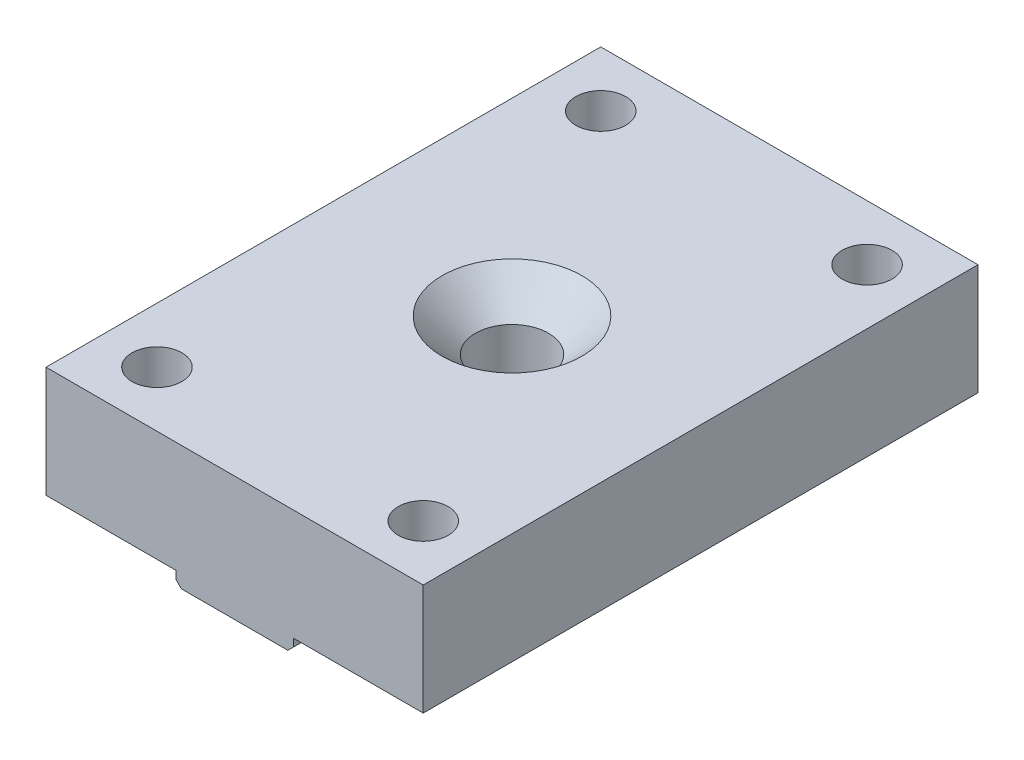
ISO-10303-21;
HEADER;
FILE_DESCRIPTION(('STEP AP214'),'2;1');
FILE_NAME('part.step','',(''),(''),'','','');
FILE_SCHEMA(('AUTOMOTIVE_DESIGN { 1 0 10303 214 1 1 1 1 }'));
ENDSEC;
DATA;
#1=APPLICATION_CONTEXT('core data for automotive mechanical design processes');
#2=APPLICATION_PROTOCOL_DEFINITION('international standard','automotive_design',2000,#1);
#3=PRODUCT_CONTEXT('',#1,'mechanical');
#4=PRODUCT('Part','Part','',(#3));
#5=PRODUCT_RELATED_PRODUCT_CATEGORY('part','',(#4));
#6=PRODUCT_DEFINITION_FORMATION('','',#4);
#7=PRODUCT_DEFINITION_CONTEXT('part definition',#1,'design');
#8=PRODUCT_DEFINITION('design','',#6,#7);
#9=PRODUCT_DEFINITION_SHAPE('','',#8);
#10=(LENGTH_UNIT() NAMED_UNIT(*) SI_UNIT(.MILLI.,.METRE.));
#11=(NAMED_UNIT(*) PLANE_ANGLE_UNIT() SI_UNIT($,.RADIAN.));
#12=(NAMED_UNIT(*) SI_UNIT($,.STERADIAN.) SOLID_ANGLE_UNIT());
#13=UNCERTAINTY_MEASURE_WITH_UNIT(LENGTH_MEASURE(1.E-05),#10,'distance_accuracy_value','');
#14=(GEOMETRIC_REPRESENTATION_CONTEXT(3) GLOBAL_UNCERTAINTY_ASSIGNED_CONTEXT((#13)) GLOBAL_UNIT_ASSIGNED_CONTEXT((#10,
#11,#12)) REPRESENTATION_CONTEXT('',''));
#15=CARTESIAN_POINT('',(0.,0.,0.));
#16=DIRECTION('',(0.,0.,1.));
#17=DIRECTION('',(1.,0.,0.));
#18=AXIS2_PLACEMENT_3D('',#15,#16,#17);
#19=CARTESIAN_POINT('',(-5.3,1.2,-50.));
#20=DIRECTION('',(-1.,0.,0.));
#21=DIRECTION('',(0.,0.,1.));
#22=AXIS2_PLACEMENT_3D('',#19,#20,#21);
#23=PLANE('',#22);
#24=DIRECTION('',(0.,-1.,0.));
#25=VECTOR('',#24,1.);
#26=CARTESIAN_POINT('',(-5.3,1.2,-50.));
#27=LINE('',#26,#25);
#28=CARTESIAN_POINT('',(-5.3,1.2,-50.));
#29=VERTEX_POINT('',#28);
#30=CARTESIAN_POINT('',(-5.3,0.499999999999994,-50.));
#31=VERTEX_POINT('',#30);
#32=EDGE_CURVE('E129',#29,#31,#27,.T.);
#33=ORIENTED_EDGE('',*,*,#32,.T.);
#34=DIRECTION('',(0.,0.,1.));
#35=VECTOR('',#34,1.);
#36=CARTESIAN_POINT('',(-5.3,0.499999999999994,-50.));
#37=LINE('',#36,#35);
#38=CARTESIAN_POINT('',(-5.3,0.499999999999994,0.));
#39=VERTEX_POINT('',#38);
#40=EDGE_CURVE('E175',#31,#39,#37,.T.);
#41=ORIENTED_EDGE('',*,*,#40,.T.);
#42=DIRECTION('',(0.,-1.,0.));
#43=VECTOR('',#42,1.);
#44=CARTESIAN_POINT('',(-5.3,1.2,0.));
#45=LINE('',#44,#43);
#46=CARTESIAN_POINT('',(-5.3,1.2,0.));
#47=VERTEX_POINT('',#46);
#48=EDGE_CURVE('E170',#47,#39,#45,.T.);
#49=ORIENTED_EDGE('',*,*,#48,.F.);
#50=DIRECTION('',(0.,0.,1.));
#51=VECTOR('',#50,1.);
#52=CARTESIAN_POINT('',(-5.3,1.2,-50.));
#53=LINE('',#52,#51);
#54=EDGE_CURVE('E173',#29,#47,#53,.T.);
#55=ORIENTED_EDGE('',*,*,#54,.F.);
#56=EDGE_LOOP('',(#33,#41,#49,#55));
#57=FACE_BOUND('',#56,.T.);
#58=ADVANCED_FACE('F39',(#57),#23,.T.);
#59=CARTESIAN_POINT('',(-17.,1.2,-50.));
#60=DIRECTION('',(0.,-1.,0.));
#61=DIRECTION('',(0.,0.,-1.));
#62=AXIS2_PLACEMENT_3D('',#59,#60,#61);
#63=PLANE('',#62);
#64=CARTESIAN_POINT('',(-12.,1.2,-5.));
#65=DIRECTION('',(0.,-1.,0.));
#66=DIRECTION('',(0.,0.,-1.));
#67=AXIS2_PLACEMENT_3D('',#64,#65,#66);
#68=CIRCLE('',#67,4.7);
#69=CARTESIAN_POINT('',(-12.,1.2,-9.7));
#70=VERTEX_POINT('',#69);
#71=EDGE_CURVE('E473',#70,#70,#68,.T.);
#72=ORIENTED_EDGE('',*,*,#71,.F.);
#73=EDGE_LOOP('',(#72));
#74=FACE_BOUND('',#73,.T.);
#75=CARTESIAN_POINT('',(-12.,1.2,-45.));
#76=DIRECTION('',(0.,-1.,0.));
#77=DIRECTION('',(0.,0.,-1.));
#78=AXIS2_PLACEMENT_3D('',#75,#76,#77);
#79=CIRCLE('',#78,4.7);
#80=CARTESIAN_POINT('',(-12.,1.2,-49.7));
#81=VERTEX_POINT('',#80);
#82=EDGE_CURVE('E455',#81,#81,#79,.T.);
#83=ORIENTED_EDGE('',*,*,#82,.F.);
#84=EDGE_LOOP('',(#83));
#85=FACE_BOUND('',#84,.T.);
#86=DIRECTION('',(1.,0.,0.));
#87=VECTOR('',#86,1.);
#88=CARTESIAN_POINT('',(-17.,1.2,0.));
#89=LINE('',#88,#87);
#90=CARTESIAN_POINT('',(-17.,1.2,0.));
#91=VERTEX_POINT('',#90);
#92=EDGE_CURVE('E167',#91,#47,#89,.T.);
#93=ORIENTED_EDGE('',*,*,#92,.F.);
#94=DIRECTION('',(0.,0.,1.));
#95=VECTOR('',#94,1.);
#96=CARTESIAN_POINT('',(-17.,1.2,-50.));
#97=LINE('',#96,#95);
#98=CARTESIAN_POINT('',(-17.,1.2,-50.));
#99=VERTEX_POINT('',#98);
#100=EDGE_CURVE('E176',#99,#91,#97,.T.);
#101=ORIENTED_EDGE('',*,*,#100,.F.);
#102=DIRECTION('',(1.,0.,0.));
#103=VECTOR('',#102,1.);
#104=CARTESIAN_POINT('',(-17.,1.2,-50.));
#105=LINE('',#104,#103);
#106=EDGE_CURVE('E146',#99,#29,#105,.T.);
#107=ORIENTED_EDGE('',*,*,#106,.T.);
#108=ORIENTED_EDGE('',*,*,#54,.T.);
#109=EDGE_LOOP('',(#93,#101,#107,#108));
#110=FACE_BOUND('',#109,.T.);
#111=ADVANCED_FACE('F222',(#74,#85,#110),#63,.T.);
#112=CARTESIAN_POINT('',(-17.,11.2,-50.));
#113=DIRECTION('',(-1.,0.,0.));
#114=DIRECTION('',(0.,0.,1.));
#115=AXIS2_PLACEMENT_3D('',#112,#113,#114);
#116=PLANE('',#115);
#117=DIRECTION('',(0.,-1.,0.));
#118=VECTOR('',#117,1.);
#119=CARTESIAN_POINT('',(-17.,11.2,0.));
#120=LINE('',#119,#118);
#121=CARTESIAN_POINT('',(-17.,11.2,0.));
#122=VERTEX_POINT('',#121);
#123=EDGE_CURVE('E164',#122,#91,#120,.T.);
#124=ORIENTED_EDGE('',*,*,#123,.F.);
#125=DIRECTION('',(0.,0.,1.));
#126=VECTOR('',#125,1.);
#127=CARTESIAN_POINT('',(-17.,11.2,-50.));
#128=LINE('',#127,#126);
#129=CARTESIAN_POINT('',(-17.,11.2,-50.));
#130=VERTEX_POINT('',#129);
#131=EDGE_CURVE('E178',#130,#122,#128,.T.);
#132=ORIENTED_EDGE('',*,*,#131,.F.);
#133=DIRECTION('',(0.,-1.,0.));
#134=VECTOR('',#133,1.);
#135=CARTESIAN_POINT('',(-17.,11.2,-50.));
#136=LINE('',#135,#134);
#137=EDGE_CURVE('E143',#130,#99,#136,.T.);
#138=ORIENTED_EDGE('',*,*,#137,.T.);
#139=ORIENTED_EDGE('',*,*,#100,.T.);
#140=EDGE_LOOP('',(#124,#132,#138,#139));
#141=FACE_BOUND('',#140,.T.);
#142=ADVANCED_FACE('F219',(#141),#116,.T.);
#143=CARTESIAN_POINT('',(17.,11.2,-50.));
#144=DIRECTION('',(0.,1.,0.));
#145=DIRECTION('',(-1.,0.,0.));
#146=AXIS2_PLACEMENT_3D('',#143,#144,#145);
#147=PLANE('',#146);
#148=CARTESIAN_POINT('',(-12.,11.2,-5.));
#149=DIRECTION('',(0.,-1.,0.));
#150=DIRECTION('',(0.,0.,-1.));
#151=AXIS2_PLACEMENT_3D('',#148,#149,#150);
#152=CIRCLE('',#151,2.25);
#153=CARTESIAN_POINT('',(-12.,11.2,-7.25));
#154=VERTEX_POINT('',#153);
#155=EDGE_CURVE('E467',#154,#154,#152,.T.);
#156=ORIENTED_EDGE('',*,*,#155,.T.);
#157=EDGE_LOOP('',(#156));
#158=FACE_BOUND('',#157,.T.);
#159=CARTESIAN_POINT('',(12.,11.2,-5.));
#160=DIRECTION('',(0.,-1.,0.));
#161=DIRECTION('',(0.,0.,-1.));
#162=AXIS2_PLACEMENT_3D('',#159,#160,#161);
#163=CIRCLE('',#162,2.25);
#164=CARTESIAN_POINT('',(12.,11.2,-7.25));
#165=VERTEX_POINT('',#164);
#166=EDGE_CURVE('E458',#165,#165,#163,.T.);
#167=ORIENTED_EDGE('',*,*,#166,.T.);
#168=EDGE_LOOP('',(#167));
#169=FACE_BOUND('',#168,.T.);
#170=CARTESIAN_POINT('',(-12.,11.2,-45.));
#171=DIRECTION('',(0.,-1.,0.));
#172=DIRECTION('',(0.,0.,-1.));
#173=AXIS2_PLACEMENT_3D('',#170,#171,#172);
#174=CIRCLE('',#173,2.25);
#175=CARTESIAN_POINT('',(-12.,11.2,-47.25));
#176=VERTEX_POINT('',#175);
#177=EDGE_CURVE('E449',#176,#176,#174,.T.);
#178=ORIENTED_EDGE('',*,*,#177,.T.);
#179=EDGE_LOOP('',(#178));
#180=FACE_BOUND('',#179,.T.);
#181=CARTESIAN_POINT('',(12.,11.2,-45.));
#182=DIRECTION('',(0.,-1.,0.));
#183=DIRECTION('',(0.,0.,-1.));
#184=AXIS2_PLACEMENT_3D('',#181,#182,#183);
#185=CIRCLE('',#184,2.25);
#186=CARTESIAN_POINT('',(12.,11.2,-47.25));
#187=VERTEX_POINT('',#186);
#188=EDGE_CURVE('E438',#187,#187,#185,.T.);
#189=ORIENTED_EDGE('',*,*,#188,.T.);
#190=EDGE_LOOP('',(#189));
#191=FACE_BOUND('',#190,.T.);
#192=CARTESIAN_POINT('',(0.,11.2,-25.));
#193=DIRECTION('',(0.,1.,0.));
#194=DIRECTION('',(0.,0.,1.));
#195=AXIS2_PLACEMENT_3D('',#192,#193,#194);
#196=CIRCLE('',#195,6.3);
#197=CARTESIAN_POINT('',(0.,11.2,-18.7));
#198=VERTEX_POINT('',#197);
#199=EDGE_CURVE('E434',#198,#198,#196,.T.);
#200=ORIENTED_EDGE('',*,*,#199,.F.);
#201=EDGE_LOOP('',(#200));
#202=FACE_BOUND('',#201,.T.);
#203=DIRECTION('',(-1.,0.,0.));
#204=VECTOR('',#203,1.);
#205=CARTESIAN_POINT('',(17.,11.2,0.));
#206=LINE('',#205,#204);
#207=CARTESIAN_POINT('',(17.,11.2,0.));
#208=VERTEX_POINT('',#207);
#209=EDGE_CURVE('E161',#208,#122,#206,.T.);
#210=ORIENTED_EDGE('',*,*,#209,.F.);
#211=DIRECTION('',(0.,0.,1.));
#212=VECTOR('',#211,1.);
#213=CARTESIAN_POINT('',(17.,11.2,-50.));
#214=LINE('',#213,#212);
#215=CARTESIAN_POINT('',(17.,11.2,-50.));
#216=VERTEX_POINT('',#215);
#217=EDGE_CURVE('E180',#216,#208,#214,.T.);
#218=ORIENTED_EDGE('',*,*,#217,.F.);
#219=DIRECTION('',(-1.,0.,0.));
#220=VECTOR('',#219,1.);
#221=CARTESIAN_POINT('',(17.,11.2,-50.));
#222=LINE('',#221,#220);
#223=EDGE_CURVE('E137',#216,#130,#222,.T.);
#224=ORIENTED_EDGE('',*,*,#223,.T.);
#225=ORIENTED_EDGE('',*,*,#131,.T.);
#226=EDGE_LOOP('',(#210,#218,#224,#225));
#227=FACE_BOUND('',#226,.T.);
#228=ADVANCED_FACE('F215',(#158,#169,#180,#191,#202,#227),#147,.T.);
#229=CARTESIAN_POINT('',(17.,1.2,-50.));
#230=DIRECTION('',(1.,0.,0.));
#231=DIRECTION('',(0.,0.,-1.));
#232=AXIS2_PLACEMENT_3D('',#229,#230,#231);
#233=PLANE('',#232);
#234=DIRECTION('',(0.,1.,0.));
#235=VECTOR('',#234,1.);
#236=CARTESIAN_POINT('',(17.,1.2,0.));
#237=LINE('',#236,#235);
#238=CARTESIAN_POINT('',(17.,1.2,0.));
#239=VERTEX_POINT('',#238);
#240=EDGE_CURVE('E158',#239,#208,#237,.T.);
#241=ORIENTED_EDGE('',*,*,#240,.F.);
#242=DIRECTION('',(0.,0.,1.));
#243=VECTOR('',#242,1.);
#244=CARTESIAN_POINT('',(17.,1.2,-50.));
#245=LINE('',#244,#243);
#246=CARTESIAN_POINT('',(17.,1.2,-50.));
#247=VERTEX_POINT('',#246);
#248=EDGE_CURVE('E128',#247,#239,#245,.T.);
#249=ORIENTED_EDGE('',*,*,#248,.F.);
#250=DIRECTION('',(0.,1.,0.));
#251=VECTOR('',#250,1.);
#252=CARTESIAN_POINT('',(17.,1.2,-50.));
#253=LINE('',#252,#251);
#254=EDGE_CURVE('E135',#247,#216,#253,.T.);
#255=ORIENTED_EDGE('',*,*,#254,.T.);
#256=ORIENTED_EDGE('',*,*,#217,.T.);
#257=EDGE_LOOP('',(#241,#249,#255,#256));
#258=FACE_BOUND('',#257,.T.);
#259=ADVANCED_FACE('F213',(#258),#233,.T.);
#260=CARTESIAN_POINT('',(5.3,1.2,-50.));
#261=DIRECTION('',(0.,-1.,0.));
#262=DIRECTION('',(0.,0.,-1.));
#263=AXIS2_PLACEMENT_3D('',#260,#261,#262);
#264=PLANE('',#263);
#265=CARTESIAN_POINT('',(12.,1.2,-5.));
#266=DIRECTION('',(0.,-1.,0.));
#267=DIRECTION('',(0.,0.,-1.));
#268=AXIS2_PLACEMENT_3D('',#265,#266,#267);
#269=CIRCLE('',#268,4.7);
#270=CARTESIAN_POINT('',(12.,1.2,-9.7));
#271=VERTEX_POINT('',#270);
#272=EDGE_CURVE('E464',#271,#271,#269,.T.);
#273=ORIENTED_EDGE('',*,*,#272,.F.);
#274=EDGE_LOOP('',(#273));
#275=FACE_BOUND('',#274,.T.);
#276=CARTESIAN_POINT('',(12.,1.2,-45.));
#277=DIRECTION('',(0.,-1.,0.));
#278=DIRECTION('',(0.,0.,-1.));
#279=AXIS2_PLACEMENT_3D('',#276,#277,#278);
#280=CIRCLE('',#279,4.7);
#281=CARTESIAN_POINT('',(12.,1.2,-49.7));
#282=VERTEX_POINT('',#281);
#283=EDGE_CURVE('E446',#282,#282,#280,.T.);
#284=ORIENTED_EDGE('',*,*,#283,.F.);
#285=EDGE_LOOP('',(#284));
#286=FACE_BOUND('',#285,.T.);
#287=DIRECTION('',(1.,0.,0.));
#288=VECTOR('',#287,1.);
#289=CARTESIAN_POINT('',(5.3,1.2,0.));
#290=LINE('',#289,#288);
#291=CARTESIAN_POINT('',(5.3,1.2,0.));
#292=VERTEX_POINT('',#291);
#293=EDGE_CURVE('E127',#292,#239,#290,.T.);
#294=ORIENTED_EDGE('',*,*,#293,.F.);
#295=DIRECTION('',(0.,0.,1.));
#296=VECTOR('',#295,1.);
#297=CARTESIAN_POINT('',(5.3,1.2,-50.));
#298=LINE('',#297,#296);
#299=CARTESIAN_POINT('',(5.3,1.2,-50.));
#300=VERTEX_POINT('',#299);
#301=EDGE_CURVE('E117',#300,#292,#298,.T.);
#302=ORIENTED_EDGE('',*,*,#301,.F.);
#303=DIRECTION('',(1.,0.,0.));
#304=VECTOR('',#303,1.);
#305=CARTESIAN_POINT('',(5.3,1.2,-50.));
#306=LINE('',#305,#304);
#307=EDGE_CURVE('E120',#300,#247,#306,.T.);
#308=ORIENTED_EDGE('',*,*,#307,.T.);
#309=ORIENTED_EDGE('',*,*,#248,.T.);
#310=EDGE_LOOP('',(#294,#302,#308,#309));
#311=FACE_BOUND('',#310,.T.);
#312=ADVANCED_FACE('F125',(#275,#286,#311),#264,.T.);
#313=CARTESIAN_POINT('',(5.3,0.,-50.));
#314=DIRECTION('',(1.,0.,0.));
#315=DIRECTION('',(0.,0.,-1.));
#316=AXIS2_PLACEMENT_3D('',#313,#314,#315);
#317=PLANE('',#316);
#318=DIRECTION('',(0.,1.,0.));
#319=VECTOR('',#318,1.);
#320=CARTESIAN_POINT('',(5.3,0.,0.));
#321=LINE('',#320,#319);
#322=CARTESIAN_POINT('',(5.3,0.5,0.));
#323=VERTEX_POINT('',#322);
#324=EDGE_CURVE('E154',#323,#292,#321,.T.);
#325=ORIENTED_EDGE('',*,*,#324,.F.);
#326=DIRECTION('',(0.,0.,-1.));
#327=VECTOR('',#326,1.);
#328=CARTESIAN_POINT('',(5.3,0.5,-50.));
#329=LINE('',#328,#327);
#330=CARTESIAN_POINT('',(5.3,0.5,-50.));
#331=VERTEX_POINT('',#330);
#332=EDGE_CURVE('E11',#323,#331,#329,.T.);
#333=ORIENTED_EDGE('',*,*,#332,.T.);
#334=DIRECTION('',(0.,1.,0.));
#335=VECTOR('',#334,1.);
#336=CARTESIAN_POINT('',(5.3,0.,-50.));
#337=LINE('',#336,#335);
#338=EDGE_CURVE('E114',#331,#300,#337,.T.);
#339=ORIENTED_EDGE('',*,*,#338,.T.);
#340=ORIENTED_EDGE('',*,*,#301,.T.);
#341=EDGE_LOOP('',(#325,#333,#339,#340));
#342=FACE_BOUND('',#341,.T.);
#343=ADVANCED_FACE('F116',(#342),#317,.T.);
#344=CARTESIAN_POINT('',(0.,0.,-50.));
#345=DIRECTION('',(0.,-1.,0.));
#346=DIRECTION('',(0.,0.,-1.));
#347=AXIS2_PLACEMENT_3D('',#344,#345,#346);
#348=PLANE('',#347);
#349=CARTESIAN_POINT('',(0.,0.,-25.));
#350=DIRECTION('',(0.,1.,0.));
#351=DIRECTION('',(0.,0.,1.));
#352=AXIS2_PLACEMENT_3D('',#349,#350,#351);
#353=CIRCLE('',#352,3.3);
#354=CARTESIAN_POINT('',(0.,0.,-21.7));
#355=VERTEX_POINT('',#354);
#356=EDGE_CURVE('E155',#355,#355,#353,.T.);
#357=ORIENTED_EDGE('',*,*,#356,.T.);
#358=EDGE_LOOP('',(#357));
#359=FACE_BOUND('',#358,.T.);
#360=DIRECTION('',(1.,0.,0.));
#361=VECTOR('',#360,1.);
#362=CARTESIAN_POINT('',(0.,0.,0.));
#363=LINE('',#362,#361);
#364=CARTESIAN_POINT('',(-4.8,0.,0.));
#365=VERTEX_POINT('',#364);
#366=CARTESIAN_POINT('',(4.80000000000001,0.,0.));
#367=VERTEX_POINT('',#366);
#368=EDGE_CURVE('E151',#365,#367,#363,.T.);
#369=ORIENTED_EDGE('',*,*,#368,.F.);
#370=DIRECTION('',(0.,0.,-1.));
#371=VECTOR('',#370,1.);
#372=CARTESIAN_POINT('',(-4.8,0.,-50.));
#373=LINE('',#372,#371);
#374=CARTESIAN_POINT('',(-4.8,0.,-50.));
#375=VERTEX_POINT('',#374);
#376=EDGE_CURVE('E192',#365,#375,#373,.T.);
#377=ORIENTED_EDGE('',*,*,#376,.T.);
#378=DIRECTION('',(1.,0.,0.));
#379=VECTOR('',#378,1.);
#380=CARTESIAN_POINT('',(-5.3,0.,-50.));
#381=LINE('',#380,#379);
#382=CARTESIAN_POINT('',(4.80000000000001,0.,-50.));
#383=VERTEX_POINT('',#382);
#384=EDGE_CURVE('E121',#375,#383,#381,.T.);
#385=ORIENTED_EDGE('',*,*,#384,.T.);
#386=DIRECTION('',(0.,0.,1.));
#387=VECTOR('',#386,1.);
#388=CARTESIAN_POINT('',(4.80000000000001,0.,-50.));
#389=LINE('',#388,#387);
#390=EDGE_CURVE('E189',#383,#367,#389,.T.);
#391=ORIENTED_EDGE('',*,*,#390,.T.);
#392=EDGE_LOOP('',(#369,#377,#385,#391));
#393=FACE_BOUND('',#392,.T.);
#394=ADVANCED_FACE('F207',(#359,#393),#348,.T.);
#395=CARTESIAN_POINT('',(0.,0.,-50.));
#396=DIRECTION('',(0.,0.,1.));
#397=DIRECTION('',(1.,0.,0.));
#398=AXIS2_PLACEMENT_3D('',#395,#396,#397);
#399=PLANE('',#398);
#400=ORIENTED_EDGE('',*,*,#384,.F.);
#401=DIRECTION('',(0.707106781186552,-0.707106781186543,0.));
#402=VECTOR('',#401,1.);
#403=CARTESIAN_POINT('',(-5.3,0.499999999999994,-50.));
#404=LINE('',#403,#402);
#405=EDGE_CURVE('E47',#375,#31,#404,.F.);
#406=ORIENTED_EDGE('',*,*,#405,.T.);
#407=ORIENTED_EDGE('',*,*,#32,.F.);
#408=ORIENTED_EDGE('',*,*,#106,.F.);
#409=ORIENTED_EDGE('',*,*,#137,.F.);
#410=ORIENTED_EDGE('',*,*,#223,.F.);
#411=ORIENTED_EDGE('',*,*,#254,.F.);
#412=ORIENTED_EDGE('',*,*,#307,.F.);
#413=ORIENTED_EDGE('',*,*,#338,.F.);
#414=DIRECTION('',(0.707106781186543,0.707106781186552,0.));
#415=VECTOR('',#414,1.);
#416=CARTESIAN_POINT('',(4.80000000000001,0.,-50.));
#417=LINE('',#416,#415);
#418=EDGE_CURVE('E59',#331,#383,#417,.F.);
#419=ORIENTED_EDGE('',*,*,#418,.T.);
#420=EDGE_LOOP('',(#400,#406,#407,#408,#409,#410,#411,#412,#413,#419));
#421=FACE_BOUND('',#420,.T.);
#422=ADVANCED_FACE('F132',(#421),#399,.F.);
#423=CARTESIAN_POINT('',(0.,0.,0.));
#424=DIRECTION('',(0.,0.,1.));
#425=DIRECTION('',(1.,0.,0.));
#426=AXIS2_PLACEMENT_3D('',#423,#424,#425);
#427=PLANE('',#426);
#428=ORIENTED_EDGE('',*,*,#48,.T.);
#429=DIRECTION('',(-0.707106781186552,0.707106781186543,0.));
#430=VECTOR('',#429,1.);
#431=CARTESIAN_POINT('',(-2.39999999999997,-2.4,0.));
#432=LINE('',#431,#430);
#433=EDGE_CURVE('E187',#39,#365,#432,.F.);
#434=ORIENTED_EDGE('',*,*,#433,.T.);
#435=ORIENTED_EDGE('',*,*,#368,.T.);
#436=DIRECTION('',(-0.707106781186543,-0.707106781186552,0.));
#437=VECTOR('',#436,1.);
#438=CARTESIAN_POINT('',(2.40000000000004,-2.4,0.));
#439=LINE('',#438,#437);
#440=EDGE_CURVE('E185',#367,#323,#439,.F.);
#441=ORIENTED_EDGE('',*,*,#440,.T.);
#442=ORIENTED_EDGE('',*,*,#324,.T.);
#443=ORIENTED_EDGE('',*,*,#293,.T.);
#444=ORIENTED_EDGE('',*,*,#240,.T.);
#445=ORIENTED_EDGE('',*,*,#209,.T.);
#446=ORIENTED_EDGE('',*,*,#123,.T.);
#447=ORIENTED_EDGE('',*,*,#92,.T.);
#448=EDGE_LOOP('',(#428,#434,#435,#441,#442,#443,#444,#445,#446,#447));
#449=FACE_BOUND('',#448,.T.);
#450=ADVANCED_FACE('F205',(#449),#427,.T.);
#451=CARTESIAN_POINT('',(0.,11.2,-25.));
#452=DIRECTION('',(0.,1.,0.));
#453=DIRECTION('',(0.,0.,1.));
#454=AXIS2_PLACEMENT_3D('',#451,#452,#453);
#455=CYLINDRICAL_SURFACE('',#454,3.3);
#456=ORIENTED_EDGE('',*,*,#356,.F.);
#457=EDGE_LOOP('',(#456));
#458=FACE_BOUND('',#457,.T.);
#459=CARTESIAN_POINT('',(0.,8.2,-25.));
#460=DIRECTION('',(0.,1.,0.));
#461=DIRECTION('',(0.,0.,1.));
#462=AXIS2_PLACEMENT_3D('',#459,#460,#461);
#463=CIRCLE('',#462,3.3);
#464=CARTESIAN_POINT('',(0.,8.2,-21.7));
#465=VERTEX_POINT('',#464);
#466=EDGE_CURVE('E433',#465,#465,#463,.T.);
#467=ORIENTED_EDGE('',*,*,#466,.T.);
#468=EDGE_LOOP('',(#467));
#469=FACE_BOUND('',#468,.T.);
#470=ADVANCED_FACE('F292',(#458,#469),#455,.F.);
#471=CARTESIAN_POINT('',(0.,11.2,-25.));
#472=DIRECTION('',(0.,1.,0.));
#473=DIRECTION('',(0.,0.,1.));
#474=AXIS2_PLACEMENT_3D('',#471,#472,#473);
#475=CONICAL_SURFACE('',#474,6.3,0.785398163397449);
#476=ORIENTED_EDGE('',*,*,#466,.F.);
#477=EDGE_LOOP('',(#476));
#478=FACE_BOUND('',#477,.T.);
#479=ORIENTED_EDGE('',*,*,#199,.T.);
#480=EDGE_LOOP('',(#479));
#481=FACE_BOUND('',#480,.T.);
#482=ADVANCED_FACE('F288',(#478,#481),#475,.F.);
#483=CARTESIAN_POINT('',(12.,1.2,-45.));
#484=DIRECTION('',(0.,-1.,0.));
#485=DIRECTION('',(0.,0.,-1.));
#486=AXIS2_PLACEMENT_3D('',#483,#484,#485);
#487=CYLINDRICAL_SURFACE('',#486,2.25);
#488=ORIENTED_EDGE('',*,*,#188,.F.);
#489=EDGE_LOOP('',(#488));
#490=FACE_BOUND('',#489,.T.);
#491=CARTESIAN_POINT('',(12.,3.65,-45.));
#492=DIRECTION('',(0.,-1.,0.));
#493=DIRECTION('',(0.,0.,-1.));
#494=AXIS2_PLACEMENT_3D('',#491,#492,#493);
#495=CIRCLE('',#494,2.25);
#496=CARTESIAN_POINT('',(12.,3.65,-47.25));
#497=VERTEX_POINT('',#496);
#498=EDGE_CURVE('E443',#497,#497,#495,.T.);
#499=ORIENTED_EDGE('',*,*,#498,.T.);
#500=EDGE_LOOP('',(#499));
#501=FACE_BOUND('',#500,.T.);
#502=ADVANCED_FACE('F284',(#490,#501),#487,.F.);
#503=CARTESIAN_POINT('',(12.,1.2,-45.));
#504=DIRECTION('',(0.,-1.,0.));
#505=DIRECTION('',(0.,0.,-1.));
#506=AXIS2_PLACEMENT_3D('',#503,#504,#505);
#507=CONICAL_SURFACE('',#506,4.7,0.785398163397449);
#508=ORIENTED_EDGE('',*,*,#498,.F.);
#509=EDGE_LOOP('',(#508));
#510=FACE_BOUND('',#509,.T.);
#511=ORIENTED_EDGE('',*,*,#283,.T.);
#512=EDGE_LOOP('',(#511));
#513=FACE_BOUND('',#512,.T.);
#514=ADVANCED_FACE('F280',(#510,#513),#507,.F.);
#515=CARTESIAN_POINT('',(-12.,1.2,-45.));
#516=DIRECTION('',(0.,-1.,0.));
#517=DIRECTION('',(0.,0.,-1.));
#518=AXIS2_PLACEMENT_3D('',#515,#516,#517);
#519=CYLINDRICAL_SURFACE('',#518,2.25);
#520=ORIENTED_EDGE('',*,*,#177,.F.);
#521=EDGE_LOOP('',(#520));
#522=FACE_BOUND('',#521,.T.);
#523=CARTESIAN_POINT('',(-12.,3.65,-45.));
#524=DIRECTION('',(0.,-1.,0.));
#525=DIRECTION('',(0.,0.,-1.));
#526=AXIS2_PLACEMENT_3D('',#523,#524,#525);
#527=CIRCLE('',#526,2.25);
#528=CARTESIAN_POINT('',(-12.,3.65,-47.25));
#529=VERTEX_POINT('',#528);
#530=EDGE_CURVE('E452',#529,#529,#527,.T.);
#531=ORIENTED_EDGE('',*,*,#530,.T.);
#532=EDGE_LOOP('',(#531));
#533=FACE_BOUND('',#532,.T.);
#534=ADVANCED_FACE('F276',(#522,#533),#519,.F.);
#535=CARTESIAN_POINT('',(-12.,1.2,-45.));
#536=DIRECTION('',(0.,-1.,0.));
#537=DIRECTION('',(0.,0.,-1.));
#538=AXIS2_PLACEMENT_3D('',#535,#536,#537);
#539=CONICAL_SURFACE('',#538,4.7,0.785398163397449);
#540=ORIENTED_EDGE('',*,*,#530,.F.);
#541=EDGE_LOOP('',(#540));
#542=FACE_BOUND('',#541,.T.);
#543=ORIENTED_EDGE('',*,*,#82,.T.);
#544=EDGE_LOOP('',(#543));
#545=FACE_BOUND('',#544,.T.);
#546=ADVANCED_FACE('F272',(#542,#545),#539,.F.);
#547=CARTESIAN_POINT('',(12.,1.2,-5.));
#548=DIRECTION('',(0.,-1.,0.));
#549=DIRECTION('',(0.,0.,-1.));
#550=AXIS2_PLACEMENT_3D('',#547,#548,#549);
#551=CYLINDRICAL_SURFACE('',#550,2.25);
#552=ORIENTED_EDGE('',*,*,#166,.F.);
#553=EDGE_LOOP('',(#552));
#554=FACE_BOUND('',#553,.T.);
#555=CARTESIAN_POINT('',(12.,3.65,-5.));
#556=DIRECTION('',(0.,-1.,0.));
#557=DIRECTION('',(0.,0.,-1.));
#558=AXIS2_PLACEMENT_3D('',#555,#556,#557);
#559=CIRCLE('',#558,2.25);
#560=CARTESIAN_POINT('',(12.,3.65,-7.25));
#561=VERTEX_POINT('',#560);
#562=EDGE_CURVE('E461',#561,#561,#559,.T.);
#563=ORIENTED_EDGE('',*,*,#562,.T.);
#564=EDGE_LOOP('',(#563));
#565=FACE_BOUND('',#564,.T.);
#566=ADVANCED_FACE('F268',(#554,#565),#551,.F.);
#567=CARTESIAN_POINT('',(12.,1.2,-5.));
#568=DIRECTION('',(0.,-1.,0.));
#569=DIRECTION('',(0.,0.,-1.));
#570=AXIS2_PLACEMENT_3D('',#567,#568,#569);
#571=CONICAL_SURFACE('',#570,4.7,0.785398163397449);
#572=ORIENTED_EDGE('',*,*,#562,.F.);
#573=EDGE_LOOP('',(#572));
#574=FACE_BOUND('',#573,.T.);
#575=ORIENTED_EDGE('',*,*,#272,.T.);
#576=EDGE_LOOP('',(#575));
#577=FACE_BOUND('',#576,.T.);
#578=ADVANCED_FACE('F260',(#574,#577),#571,.F.);
#579=CARTESIAN_POINT('',(-12.,1.2,-5.));
#580=DIRECTION('',(0.,-1.,0.));
#581=DIRECTION('',(0.,0.,-1.));
#582=AXIS2_PLACEMENT_3D('',#579,#580,#581);
#583=CYLINDRICAL_SURFACE('',#582,2.25);
#584=ORIENTED_EDGE('',*,*,#155,.F.);
#585=EDGE_LOOP('',(#584));
#586=FACE_BOUND('',#585,.T.);
#587=CARTESIAN_POINT('',(-12.,3.65,-5.));
#588=DIRECTION('',(0.,-1.,0.));
#589=DIRECTION('',(0.,0.,-1.));
#590=AXIS2_PLACEMENT_3D('',#587,#588,#589);
#591=CIRCLE('',#590,2.25);
#592=CARTESIAN_POINT('',(-12.,3.65,-7.25));
#593=VERTEX_POINT('',#592);
#594=EDGE_CURVE('E470',#593,#593,#591,.T.);
#595=ORIENTED_EDGE('',*,*,#594,.T.);
#596=EDGE_LOOP('',(#595));
#597=FACE_BOUND('',#596,.T.);
#598=ADVANCED_FACE('F254',(#586,#597),#583,.F.);
#599=CARTESIAN_POINT('',(-12.,1.2,-5.));
#600=DIRECTION('',(0.,-1.,0.));
#601=DIRECTION('',(0.,0.,-1.));
#602=AXIS2_PLACEMENT_3D('',#599,#600,#601);
#603=CONICAL_SURFACE('',#602,4.7,0.785398163397449);
#604=ORIENTED_EDGE('',*,*,#594,.F.);
#605=EDGE_LOOP('',(#604));
#606=FACE_BOUND('',#605,.T.);
#607=ORIENTED_EDGE('',*,*,#71,.T.);
#608=EDGE_LOOP('',(#607));
#609=FACE_BOUND('',#608,.T.);
#610=ADVANCED_FACE('F249',(#606,#609),#603,.F.);
#611=CARTESIAN_POINT('',(-5.3,0.499999999999994,-50.));
#612=DIRECTION('',(0.707106781186543,0.707106781186552,0.));
#613=DIRECTION('',(0.,0.,1.));
#614=AXIS2_PLACEMENT_3D('',#611,#612,#613);
#615=PLANE('',#614);
#616=ORIENTED_EDGE('',*,*,#405,.F.);
#617=ORIENTED_EDGE('',*,*,#376,.F.);
#618=ORIENTED_EDGE('',*,*,#433,.F.);
#619=ORIENTED_EDGE('',*,*,#40,.F.);
#620=EDGE_LOOP('',(#616,#617,#618,#619));
#621=FACE_BOUND('',#620,.T.);
#622=ADVANCED_FACE('F202',(#621),#615,.F.);
#623=CARTESIAN_POINT('',(4.80000000000001,0.,-50.));
#624=DIRECTION('',(-0.707106781186552,0.707106781186543,0.));
#625=DIRECTION('',(0.,0.,1.));
#626=AXIS2_PLACEMENT_3D('',#623,#624,#625);
#627=PLANE('',#626);
#628=ORIENTED_EDGE('',*,*,#418,.F.);
#629=ORIENTED_EDGE('',*,*,#332,.F.);
#630=ORIENTED_EDGE('',*,*,#440,.F.);
#631=ORIENTED_EDGE('',*,*,#390,.F.);
#632=EDGE_LOOP('',(#628,#629,#630,#631));
#633=FACE_BOUND('',#632,.T.);
#634=ADVANCED_FACE('F41',(#633),#627,.F.);
#635=CLOSED_SHELL('',(#58,#111,#142,#228,#259,#312,#343,#394,#422,#450,#470,#482,#502,#514,#534,
#546,#566,#578,#598,#610,#622,#634));
#636=MANIFOLD_SOLID_BREP('B2',#635);
#637=ADVANCED_BREP_SHAPE_REPRESENTATION('',(#18,#636),#14);
#638=SHAPE_DEFINITION_REPRESENTATION(#9,#637);
ENDSEC;
END-ISO-10303-21;
